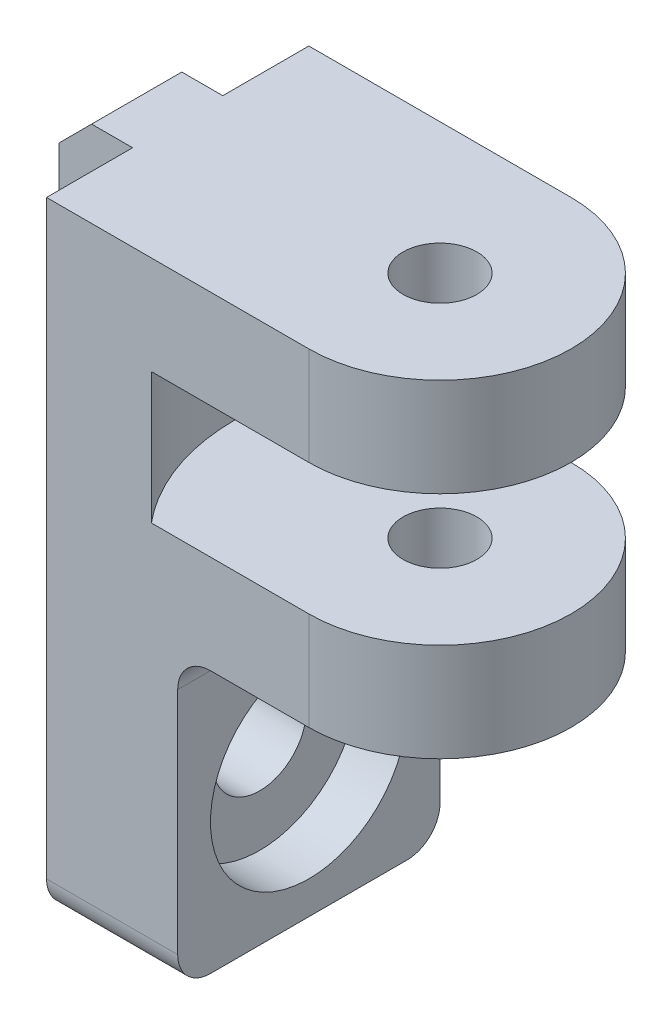
ISO-10303-21;
HEADER;
FILE_DESCRIPTION(('STEP AP214'),'2;1');
FILE_NAME('part.step','',(''),(''),'','','');
FILE_SCHEMA(('AUTOMOTIVE_DESIGN { 1 0 10303 214 1 1 1 1 }'));
ENDSEC;
DATA;
#1=APPLICATION_CONTEXT('core data for automotive mechanical design processes');
#2=APPLICATION_PROTOCOL_DEFINITION('international standard','automotive_design',2000,#1);
#3=PRODUCT_CONTEXT('',#1,'mechanical');
#4=PRODUCT('Part','Part','',(#3));
#5=PRODUCT_RELATED_PRODUCT_CATEGORY('part','',(#4));
#6=PRODUCT_DEFINITION_FORMATION('','',#4);
#7=PRODUCT_DEFINITION_CONTEXT('part definition',#1,'design');
#8=PRODUCT_DEFINITION('design','',#6,#7);
#9=PRODUCT_DEFINITION_SHAPE('','',#8);
#10=(LENGTH_UNIT() NAMED_UNIT(*) SI_UNIT(.MILLI.,.METRE.));
#11=(NAMED_UNIT(*) PLANE_ANGLE_UNIT() SI_UNIT($,.RADIAN.));
#12=(NAMED_UNIT(*) SI_UNIT($,.STERADIAN.) SOLID_ANGLE_UNIT());
#13=UNCERTAINTY_MEASURE_WITH_UNIT(LENGTH_MEASURE(1.E-05),#10,'distance_accuracy_value','');
#14=(GEOMETRIC_REPRESENTATION_CONTEXT(3) GLOBAL_UNCERTAINTY_ASSIGNED_CONTEXT((#13)) GLOBAL_UNIT_ASSIGNED_CONTEXT((#10,
#11,#12)) REPRESENTATION_CONTEXT('',''));
#15=CARTESIAN_POINT('',(0.,0.,0.));
#16=DIRECTION('',(0.,0.,1.));
#17=DIRECTION('',(1.,0.,0.));
#18=AXIS2_PLACEMENT_3D('',#15,#16,#17);
#19=CARTESIAN_POINT('',(8.,-2.08853598023942,48.8465560011747));
#20=DIRECTION('',(0.,0.,-1.));
#21=DIRECTION('',(-1.,0.,0.));
#22=AXIS2_PLACEMENT_3D('',#19,#20,#21);
#23=PLANE('',#22);
#24=DIRECTION('',(0.,-1.,0.));
#25=VECTOR('',#24,1.);
#26=CARTESIAN_POINT('',(0.,-2.08853598023942,48.8465560011747));
#27=LINE('',#26,#25);
#28=CARTESIAN_POINT('',(0.,35.9114640197606,48.8465560011747));
#29=VERTEX_POINT('',#28);
#30=CARTESIAN_POINT('',(0.,-0.0885359802394229,48.8465560011747));
#31=VERTEX_POINT('',#30);
#32=EDGE_CURVE('E302',#29,#31,#27,.T.);
#33=ORIENTED_EDGE('',*,*,#32,.T.);
#34=DIRECTION('',(-1.,0.,0.));
#35=VECTOR('',#34,1.);
#36=CARTESIAN_POINT('',(8.,-0.0885359802394229,48.8465560011747));
#37=LINE('',#36,#35);
#38=CARTESIAN_POINT('',(8.,-0.0885359802394229,48.8465560011747));
#39=VERTEX_POINT('',#38);
#40=EDGE_CURVE('E11',#31,#39,#37,.F.);
#41=ORIENTED_EDGE('',*,*,#40,.T.);
#42=DIRECTION('',(0.,-1.,0.));
#43=VECTOR('',#42,1.);
#44=CARTESIAN_POINT('',(8.,-2.08853598023942,48.8465560011747));
#45=LINE('',#44,#43);
#46=CARTESIAN_POINT('',(8.,13.9114640197606,48.8465560011747));
#47=VERTEX_POINT('',#46);
#48=EDGE_CURVE('E309',#47,#39,#45,.T.);
#49=ORIENTED_EDGE('',*,*,#48,.F.);
#50=CARTESIAN_POINT('',(10.,13.9114640197606,48.8465560011747));
#51=DIRECTION('',(0.,0.,-1.));
#52=DIRECTION('',(-1.,0.,0.));
#53=AXIS2_PLACEMENT_3D('',#50,#51,#52);
#54=CIRCLE('',#53,2.);
#55=CARTESIAN_POINT('',(10.,15.9114640197606,48.8465560011747));
#56=VERTEX_POINT('',#55);
#57=EDGE_CURVE('E265',#47,#56,#54,.T.);
#58=ORIENTED_EDGE('',*,*,#57,.T.);
#59=DIRECTION('',(-1.,0.,0.));
#60=VECTOR('',#59,1.);
#61=CARTESIAN_POINT('',(8.,15.9114640197606,48.8465560011747));
#62=LINE('',#61,#60);
#63=CARTESIAN_POINT('',(16.,15.9114640197606,48.8465560011747));
#64=VERTEX_POINT('',#63);
#65=EDGE_CURVE('E225',#64,#56,#62,.T.);
#66=ORIENTED_EDGE('',*,*,#65,.F.);
#67=DIRECTION('',(0.,1.,0.));
#68=VECTOR('',#67,1.);
#69=CARTESIAN_POINT('',(16.,15.9114640197606,48.8465560011747));
#70=LINE('',#69,#68);
#71=CARTESIAN_POINT('',(16.,21.9114640197606,48.8465560011747));
#72=VERTEX_POINT('',#71);
#73=EDGE_CURVE('E231',#64,#72,#70,.T.);
#74=ORIENTED_EDGE('',*,*,#73,.T.);
#75=DIRECTION('',(1.,0.,0.));
#76=VECTOR('',#75,1.);
#77=CARTESIAN_POINT('',(8.,21.9114640197606,48.8465560011747));
#78=LINE('',#77,#76);
#79=CARTESIAN_POINT('',(6.39531364385072,21.9114640197606,48.8465560011747));
#80=VERTEX_POINT('',#79);
#81=EDGE_CURVE('E202',#80,#72,#78,.T.);
#82=ORIENTED_EDGE('',*,*,#81,.F.);
#83=DIRECTION('',(0.,1.,0.));
#84=VECTOR('',#83,1.);
#85=CARTESIAN_POINT('',(6.39531364385072,21.9114640197606,48.8465560011747));
#86=LINE('',#85,#84);
#87=CARTESIAN_POINT('',(6.39531364385072,29.9114640197606,48.8465560011747));
#88=VERTEX_POINT('',#87);
#89=EDGE_CURVE('E204',#80,#88,#86,.T.);
#90=ORIENTED_EDGE('',*,*,#89,.T.);
#91=DIRECTION('',(1.,0.,0.));
#92=VECTOR('',#91,1.);
#93=CARTESIAN_POINT('',(8.,29.9114640197606,48.8465560011747));
#94=LINE('',#93,#92);
#95=CARTESIAN_POINT('',(16.,29.9114640197606,48.8465560011747));
#96=VERTEX_POINT('',#95);
#97=EDGE_CURVE('E184',#88,#96,#94,.T.);
#98=ORIENTED_EDGE('',*,*,#97,.T.);
#99=CARTESIAN_POINT('',(16.,35.9114640197606,48.8465560011747));
#100=VERTEX_POINT('',#99);
#101=EDGE_CURVE('E228',#96,#100,#70,.T.);
#102=ORIENTED_EDGE('',*,*,#101,.T.);
#103=DIRECTION('',(-1.,0.,0.));
#104=VECTOR('',#103,1.);
#105=CARTESIAN_POINT('',(8.,35.9114640197606,48.8465560011747));
#106=LINE('',#105,#104);
#107=EDGE_CURVE('E260',#100,#29,#106,.T.);
#108=ORIENTED_EDGE('',*,*,#107,.T.);
#109=EDGE_LOOP('',(#33,#41,#49,#58,#66,#74,#82,#90,#98,#102,#108));
#110=FACE_BOUND('',#109,.T.);
#111=ADVANCED_FACE('F32',(#110),#23,.F.);
#112=CARTESIAN_POINT('',(8.,35.9114640197606,32.8465560011747));
#113=DIRECTION('',(0.,0.,1.));
#114=DIRECTION('',(1.,0.,0.));
#115=AXIS2_PLACEMENT_3D('',#112,#113,#114);
#116=PLANE('',#115);
#117=DIRECTION('',(0.,1.,0.));
#118=VECTOR('',#117,1.);
#119=CARTESIAN_POINT('',(8.,35.9114640197606,32.8465560011747));
#120=LINE('',#119,#118);
#121=CARTESIAN_POINT('',(8.,-0.0885359802394181,32.8465560011747));
#122=VERTEX_POINT('',#121);
#123=CARTESIAN_POINT('',(8.,13.9114640197606,32.8465560011747));
#124=VERTEX_POINT('',#123);
#125=EDGE_CURVE('E300',#122,#124,#120,.T.);
#126=ORIENTED_EDGE('',*,*,#125,.F.);
#127=DIRECTION('',(-1.,0.,0.));
#128=VECTOR('',#127,1.);
#129=CARTESIAN_POINT('',(8.,-0.0885359802394181,32.8465560011747));
#130=LINE('',#129,#128);
#131=CARTESIAN_POINT('',(0.,-0.0885359802394181,32.8465560011747));
#132=VERTEX_POINT('',#131);
#133=EDGE_CURVE('E176',#122,#132,#130,.T.);
#134=ORIENTED_EDGE('',*,*,#133,.T.);
#135=DIRECTION('',(0.,1.,0.));
#136=VECTOR('',#135,1.);
#137=CARTESIAN_POINT('',(0.,35.9114640197606,32.8465560011747));
#138=LINE('',#137,#136);
#139=CARTESIAN_POINT('',(0.,35.9114640197606,32.8465560011747));
#140=VERTEX_POINT('',#139);
#141=EDGE_CURVE('E307',#132,#140,#138,.T.);
#142=ORIENTED_EDGE('',*,*,#141,.T.);
#143=DIRECTION('',(-1.,0.,0.));
#144=VECTOR('',#143,1.);
#145=CARTESIAN_POINT('',(8.,35.9114640197606,32.8465560011747));
#146=LINE('',#145,#144);
#147=CARTESIAN_POINT('',(16.,35.9114640197606,32.8465560011747));
#148=VERTEX_POINT('',#147);
#149=EDGE_CURVE('E310',#148,#140,#146,.T.);
#150=ORIENTED_EDGE('',*,*,#149,.F.);
#151=DIRECTION('',(0.,1.,0.));
#152=VECTOR('',#151,1.);
#153=CARTESIAN_POINT('',(16.,15.9114640197606,32.8465560011747));
#154=LINE('',#153,#152);
#155=CARTESIAN_POINT('',(16.,29.9114640197606,32.8465560011747));
#156=VERTEX_POINT('',#155);
#157=EDGE_CURVE('E190',#156,#148,#154,.T.);
#158=ORIENTED_EDGE('',*,*,#157,.F.);
#159=DIRECTION('',(-1.,0.,0.));
#160=VECTOR('',#159,1.);
#161=CARTESIAN_POINT('',(8.,29.9114640197606,32.8465560011747));
#162=LINE('',#161,#160);
#163=CARTESIAN_POINT('',(6.39531364385072,29.9114640197606,32.8465560011747));
#164=VERTEX_POINT('',#163);
#165=EDGE_CURVE('E181',#156,#164,#162,.T.);
#166=ORIENTED_EDGE('',*,*,#165,.T.);
#167=DIRECTION('',(0.,1.,0.));
#168=VECTOR('',#167,1.);
#169=CARTESIAN_POINT('',(6.39531364385072,21.9114640197606,32.8465560011747));
#170=LINE('',#169,#168);
#171=CARTESIAN_POINT('',(6.39531364385072,21.9114640197606,32.8465560011747));
#172=VERTEX_POINT('',#171);
#173=EDGE_CURVE('E166',#164,#172,#170,.F.);
#174=ORIENTED_EDGE('',*,*,#173,.T.);
#175=DIRECTION('',(-1.,0.,0.));
#176=VECTOR('',#175,1.);
#177=CARTESIAN_POINT('',(8.,21.9114640197606,32.8465560011747));
#178=LINE('',#177,#176);
#179=CARTESIAN_POINT('',(16.,21.9114640197606,32.8465560011747));
#180=VERTEX_POINT('',#179);
#181=EDGE_CURVE('E200',#180,#172,#178,.T.);
#182=ORIENTED_EDGE('',*,*,#181,.F.);
#183=CARTESIAN_POINT('',(16.,15.9114640197606,32.8465560011747));
#184=VERTEX_POINT('',#183);
#185=EDGE_CURVE('E234',#184,#180,#154,.T.);
#186=ORIENTED_EDGE('',*,*,#185,.F.);
#187=DIRECTION('',(1.,0.,0.));
#188=VECTOR('',#187,1.);
#189=CARTESIAN_POINT('',(16.,15.9114640197606,32.8465560011747));
#190=LINE('',#189,#188);
#191=CARTESIAN_POINT('',(10.,15.9114640197606,32.8465560011747));
#192=VERTEX_POINT('',#191);
#193=EDGE_CURVE('E221',#192,#184,#190,.T.);
#194=ORIENTED_EDGE('',*,*,#193,.F.);
#195=CARTESIAN_POINT('',(10.,13.9114640197606,32.8465560011747));
#196=DIRECTION('',(0.,0.,1.));
#197=DIRECTION('',(1.,0.,0.));
#198=AXIS2_PLACEMENT_3D('',#195,#196,#197);
#199=CIRCLE('',#198,2.);
#200=EDGE_CURVE('E262',#192,#124,#199,.T.);
#201=ORIENTED_EDGE('',*,*,#200,.T.);
#202=EDGE_LOOP('',(#126,#134,#142,#150,#158,#166,#174,#182,#186,#194,#201));
#203=FACE_BOUND('',#202,.T.);
#204=ADVANCED_FACE('F188',(#203),#116,.F.);
#205=CARTESIAN_POINT('',(16.,15.9114640197606,40.8465560011747));
#206=DIRECTION('',(0.,1.,0.));
#207=DIRECTION('',(0.,0.,1.));
#208=AXIS2_PLACEMENT_3D('',#205,#206,#207);
#209=CYLINDRICAL_SURFACE('',#208,8.);
#210=CARTESIAN_POINT('',(16.,21.9114640197606,40.8465560011747));
#211=DIRECTION('',(0.,1.,0.));
#212=DIRECTION('',(0.,0.,1.));
#213=AXIS2_PLACEMENT_3D('',#210,#211,#212);
#214=CIRCLE('',#213,8.);
#215=EDGE_CURVE('E198',#72,#180,#214,.T.);
#216=ORIENTED_EDGE('',*,*,#215,.F.);
#217=ORIENTED_EDGE('',*,*,#73,.F.);
#218=CARTESIAN_POINT('',(16.,15.9114640197606,40.8465560011747));
#219=DIRECTION('',(0.,-1.,0.));
#220=DIRECTION('',(0.,0.,-1.));
#221=AXIS2_PLACEMENT_3D('',#218,#219,#220);
#222=CIRCLE('',#221,8.);
#223=EDGE_CURVE('E223',#184,#64,#222,.T.);
#224=ORIENTED_EDGE('',*,*,#223,.F.);
#225=ORIENTED_EDGE('',*,*,#185,.T.);
#226=EDGE_LOOP('',(#216,#217,#224,#225));
#227=FACE_BOUND('',#226,.T.);
#228=ADVANCED_FACE('F401',(#227),#209,.T.);
#229=CARTESIAN_POINT('',(16.,15.9114640197606,40.8465560011747));
#230=DIRECTION('',(0.,1.,0.));
#231=DIRECTION('',(0.,0.,1.));
#232=AXIS2_PLACEMENT_3D('',#229,#230,#231);
#233=CYLINDRICAL_SURFACE('',#232,2.25);
#234=CARTESIAN_POINT('',(16.,15.9114640197606,40.8465560011747));
#235=DIRECTION('',(0.,-1.,0.));
#236=DIRECTION('',(0.,0.,-1.));
#237=AXIS2_PLACEMENT_3D('',#234,#235,#236);
#238=CIRCLE('',#237,2.25);
#239=CARTESIAN_POINT('',(16.,15.9114640197606,38.5965560011747));
#240=VERTEX_POINT('',#239);
#241=EDGE_CURVE('E213',#240,#240,#238,.T.);
#242=ORIENTED_EDGE('',*,*,#241,.T.);
#243=EDGE_LOOP('',(#242));
#244=FACE_BOUND('',#243,.T.);
#245=CARTESIAN_POINT('',(16.,21.9114640197606,40.8465560011747));
#246=DIRECTION('',(0.,1.,0.));
#247=DIRECTION('',(0.,0.,1.));
#248=AXIS2_PLACEMENT_3D('',#245,#246,#247);
#249=CIRCLE('',#248,2.25);
#250=CARTESIAN_POINT('',(16.,21.9114640197606,43.0965560011747));
#251=VERTEX_POINT('',#250);
#252=EDGE_CURVE('E193',#251,#251,#249,.T.);
#253=ORIENTED_EDGE('',*,*,#252,.T.);
#254=EDGE_LOOP('',(#253));
#255=FACE_BOUND('',#254,.T.);
#256=ADVANCED_FACE('F520',(#244,#255),#233,.F.);
#257=CARTESIAN_POINT('',(-2.,5.91146401976058,40.8465560011747));
#258=DIRECTION('',(1.,0.,0.));
#259=DIRECTION('',(0.,0.,-1.));
#260=AXIS2_PLACEMENT_3D('',#257,#258,#259);
#261=CYLINDRICAL_SURFACE('',#260,2.85);
#262=CARTESIAN_POINT('',(0.,5.91146401976058,40.8465560011747));
#263=DIRECTION('',(-1.,0.,0.));
#264=DIRECTION('',(0.,0.,1.));
#265=AXIS2_PLACEMENT_3D('',#262,#263,#264);
#266=CIRCLE('',#265,2.85);
#267=CARTESIAN_POINT('',(0.,5.91146401976058,43.6965560011747));
#268=VERTEX_POINT('',#267);
#269=EDGE_CURVE('E220',#268,#268,#266,.T.);
#270=ORIENTED_EDGE('',*,*,#269,.T.);
#271=EDGE_LOOP('',(#270));
#272=FACE_BOUND('',#271,.T.);
#273=CARTESIAN_POINT('',(5.,5.91146401976058,40.8465560011747));
#274=DIRECTION('',(1.,0.,0.));
#275=DIRECTION('',(0.,0.,-1.));
#276=AXIS2_PLACEMENT_3D('',#273,#274,#275);
#277=CIRCLE('',#276,2.85);
#278=CARTESIAN_POINT('',(5.,5.91146401976058,37.9965560011747));
#279=VERTEX_POINT('',#278);
#280=EDGE_CURVE('E210',#279,#279,#277,.F.);
#281=ORIENTED_EDGE('',*,*,#280,.F.);
#282=EDGE_LOOP('',(#281));
#283=FACE_BOUND('',#282,.T.);
#284=ADVANCED_FACE('F476',(#272,#283),#261,.F.);
#285=CARTESIAN_POINT('',(8.,0.,0.));
#286=DIRECTION('',(-1.,0.,0.));
#287=DIRECTION('',(0.,0.,1.));
#288=AXIS2_PLACEMENT_3D('',#285,#286,#287);
#289=PLANE('',#288);
#290=CARTESIAN_POINT('',(8.,5.91146401976058,40.8465560011747));
#291=DIRECTION('',(1.,0.,0.));
#292=DIRECTION('',(0.,0.,-1.));
#293=AXIS2_PLACEMENT_3D('',#290,#291,#292);
#294=CIRCLE('',#293,5.99999999999999);
#295=CARTESIAN_POINT('',(8.,5.91146401976058,34.8465560011747));
#296=VERTEX_POINT('',#295);
#297=EDGE_CURVE('E206',#296,#296,#294,.T.);
#298=ORIENTED_EDGE('',*,*,#297,.F.);
#299=EDGE_LOOP('',(#298));
#300=FACE_BOUND('',#299,.T.);
#301=DIRECTION('',(0.,0.,-1.));
#302=VECTOR('',#301,1.);
#303=CARTESIAN_POINT('',(8.,-2.08853598023942,32.8465560011747));
#304=LINE('',#303,#302);
#305=CARTESIAN_POINT('',(8.,-2.08853598023942,46.8465560011747));
#306=VERTEX_POINT('',#305);
#307=CARTESIAN_POINT('',(8.,-2.08853598023942,34.8465560011747));
#308=VERTEX_POINT('',#307);
#309=EDGE_CURVE('E369',#306,#308,#304,.T.);
#310=ORIENTED_EDGE('',*,*,#309,.T.);
#311=CARTESIAN_POINT('',(8.,-0.0885359802394181,34.8465560011747));
#312=DIRECTION('',(-1.,0.,0.));
#313=DIRECTION('',(0.,0.,1.));
#314=AXIS2_PLACEMENT_3D('',#311,#312,#313);
#315=CIRCLE('',#314,2.);
#316=EDGE_CURVE('E40',#308,#122,#315,.F.);
#317=ORIENTED_EDGE('',*,*,#316,.T.);
#318=ORIENTED_EDGE('',*,*,#125,.T.);
#319=DIRECTION('',(0.,0.,-1.));
#320=VECTOR('',#319,1.);
#321=CARTESIAN_POINT('',(8.,13.9114640197606,0.));
#322=LINE('',#321,#320);
#323=EDGE_CURVE('E259',#124,#47,#322,.F.);
#324=ORIENTED_EDGE('',*,*,#323,.T.);
#325=ORIENTED_EDGE('',*,*,#48,.T.);
#326=CARTESIAN_POINT('',(8.,-0.088535980239423,46.8465560011747));
#327=DIRECTION('',(-1.,0.,0.));
#328=DIRECTION('',(0.,0.,1.));
#329=AXIS2_PLACEMENT_3D('',#326,#327,#328);
#330=CIRCLE('',#329,2.);
#331=EDGE_CURVE('E365',#39,#306,#330,.F.);
#332=ORIENTED_EDGE('',*,*,#331,.T.);
#333=EDGE_LOOP('',(#310,#317,#318,#324,#325,#332));
#334=FACE_BOUND('',#333,.T.);
#335=ADVANCED_FACE('F368',(#300,#334),#289,.F.);
#336=CARTESIAN_POINT('',(8.,35.9114640197606,48.8465560011747));
#337=DIRECTION('',(0.,-1.,0.));
#338=DIRECTION('',(0.,0.,-1.));
#339=AXIS2_PLACEMENT_3D('',#336,#337,#338);
#340=PLANE('',#339);
#341=DIRECTION('',(1.,0.,0.));
#342=VECTOR('',#341,1.);
#343=CARTESIAN_POINT('',(-4.5,35.9114640197606,38.0965560011746));
#344=LINE('',#343,#342);
#345=CARTESIAN_POINT('',(-2.5,35.9114640197606,38.0965560011746));
#346=VERTEX_POINT('',#345);
#347=CARTESIAN_POINT('',(0.,35.9114640197606,38.0965560011746));
#348=VERTEX_POINT('',#347);
#349=EDGE_CURVE('E277',#346,#348,#344,.T.);
#350=ORIENTED_EDGE('',*,*,#349,.F.);
#351=DIRECTION('',(0.,0.,1.));
#352=VECTOR('',#351,1.);
#353=CARTESIAN_POINT('',(-2.5,35.9114640197606,43.5965560011746));
#354=LINE('',#353,#352);
#355=CARTESIAN_POINT('',(-2.5,35.9114640197606,43.5965560011746));
#356=VERTEX_POINT('',#355);
#357=EDGE_CURVE('E177',#346,#356,#354,.T.);
#358=ORIENTED_EDGE('',*,*,#357,.T.);
#359=DIRECTION('',(1.,0.,0.));
#360=VECTOR('',#359,1.);
#361=CARTESIAN_POINT('',(-4.5,35.9114640197606,43.5965560011746));
#362=LINE('',#361,#360);
#363=CARTESIAN_POINT('',(0.,35.9114640197606,43.5965560011747));
#364=VERTEX_POINT('',#363);
#365=EDGE_CURVE('E274',#356,#364,#362,.T.);
#366=ORIENTED_EDGE('',*,*,#365,.T.);
#367=DIRECTION('',(0.,0.,1.));
#368=VECTOR('',#367,1.);
#369=CARTESIAN_POINT('',(0.,35.9114640197606,48.8465560011747));
#370=LINE('',#369,#368);
#371=EDGE_CURVE('E276',#364,#29,#370,.T.);
#372=ORIENTED_EDGE('',*,*,#371,.T.);
#373=ORIENTED_EDGE('',*,*,#107,.F.);
#374=CARTESIAN_POINT('',(16.,35.9114640197606,40.8465560011747));
#375=DIRECTION('',(0.,-1.,0.));
#376=DIRECTION('',(0.,0.,-1.));
#377=AXIS2_PLACEMENT_3D('',#374,#375,#376);
#378=CIRCLE('',#377,8.);
#379=EDGE_CURVE('E216',#148,#100,#378,.T.);
#380=ORIENTED_EDGE('',*,*,#379,.F.);
#381=ORIENTED_EDGE('',*,*,#149,.T.);
#382=EDGE_CURVE('E295',#140,#348,#370,.T.);
#383=ORIENTED_EDGE('',*,*,#382,.T.);
#384=EDGE_LOOP('',(#350,#358,#366,#372,#373,#380,#381,#383));
#385=FACE_BOUND('',#384,.T.);
#386=CARTESIAN_POINT('',(16.,35.9114640197606,40.8465560011747));
#387=DIRECTION('',(0.,-1.,0.));
#388=DIRECTION('',(0.,0.,-1.));
#389=AXIS2_PLACEMENT_3D('',#386,#387,#388);
#390=CIRCLE('',#389,2.25);
#391=CARTESIAN_POINT('',(16.,35.9114640197606,38.5965560011747));
#392=VERTEX_POINT('',#391);
#393=EDGE_CURVE('E217',#392,#392,#390,.T.);
#394=ORIENTED_EDGE('',*,*,#393,.T.);
#395=EDGE_LOOP('',(#394));
#396=FACE_BOUND('',#395,.T.);
#397=ADVANCED_FACE('F319',(#385,#396),#340,.F.);
#398=CARTESIAN_POINT('',(8.,-2.08853598023942,32.8465560011747));
#399=DIRECTION('',(0.,1.,0.));
#400=DIRECTION('',(0.,0.,1.));
#401=AXIS2_PLACEMENT_3D('',#398,#399,#400);
#402=PLANE('',#401);
#403=DIRECTION('',(0.,0.,-1.));
#404=VECTOR('',#403,1.);
#405=CARTESIAN_POINT('',(0.,-2.08853598023942,32.8465560011747));
#406=LINE('',#405,#404);
#407=CARTESIAN_POINT('',(0.,-2.08853598023942,46.8465560011747));
#408=VERTEX_POINT('',#407);
#409=CARTESIAN_POINT('',(0.,-2.08853598023942,34.8465560011747));
#410=VERTEX_POINT('',#409);
#411=EDGE_CURVE('E305',#408,#410,#406,.T.);
#412=ORIENTED_EDGE('',*,*,#411,.T.);
#413=DIRECTION('',(-1.,0.,0.));
#414=VECTOR('',#413,1.);
#415=CARTESIAN_POINT('',(8.,-2.08853598023942,34.8465560011747));
#416=LINE('',#415,#414);
#417=EDGE_CURVE('E53',#410,#308,#416,.F.);
#418=ORIENTED_EDGE('',*,*,#417,.T.);
#419=ORIENTED_EDGE('',*,*,#309,.F.);
#420=DIRECTION('',(-1.,0.,0.));
#421=VECTOR('',#420,1.);
#422=CARTESIAN_POINT('',(8.,-2.08853598023942,46.8465560011747));
#423=LINE('',#422,#421);
#424=EDGE_CURVE('E361',#306,#408,#423,.T.);
#425=ORIENTED_EDGE('',*,*,#424,.T.);
#426=EDGE_LOOP('',(#412,#418,#419,#425));
#427=FACE_BOUND('',#426,.T.);
#428=ADVANCED_FACE('F376',(#427),#402,.F.);
#429=CARTESIAN_POINT('',(0.,0.,0.));
#430=DIRECTION('',(-1.,0.,0.));
#431=DIRECTION('',(0.,0.,1.));
#432=AXIS2_PLACEMENT_3D('',#429,#430,#431);
#433=PLANE('',#432);
#434=ORIENTED_EDGE('',*,*,#269,.F.);
#435=EDGE_LOOP('',(#434));
#436=FACE_BOUND('',#435,.T.);
#437=ORIENTED_EDGE('',*,*,#141,.F.);
#438=CARTESIAN_POINT('',(0.,-0.0885359802394181,34.8465560011747));
#439=DIRECTION('',(-1.,0.,0.));
#440=DIRECTION('',(0.,0.,1.));
#441=AXIS2_PLACEMENT_3D('',#438,#439,#440);
#442=CIRCLE('',#441,2.);
#443=EDGE_CURVE('E359',#132,#410,#442,.T.);
#444=ORIENTED_EDGE('',*,*,#443,.T.);
#445=ORIENTED_EDGE('',*,*,#411,.F.);
#446=CARTESIAN_POINT('',(0.,-0.088535980239423,46.8465560011747));
#447=DIRECTION('',(-1.,0.,0.));
#448=DIRECTION('',(0.,0.,1.));
#449=AXIS2_PLACEMENT_3D('',#446,#447,#448);
#450=CIRCLE('',#449,2.);
#451=EDGE_CURVE('E357',#408,#31,#450,.T.);
#452=ORIENTED_EDGE('',*,*,#451,.T.);
#453=ORIENTED_EDGE('',*,*,#32,.F.);
#454=ORIENTED_EDGE('',*,*,#371,.F.);
#455=DIRECTION('',(0.,1.,0.));
#456=VECTOR('',#455,1.);
#457=CARTESIAN_POINT('',(0.,35.9114640197606,43.5965560011746));
#458=LINE('',#457,#456);
#459=CARTESIAN_POINT('',(0.,13.9114640197606,43.5965560011747));
#460=VERTEX_POINT('',#459);
#461=EDGE_CURVE('E237',#460,#364,#458,.T.);
#462=ORIENTED_EDGE('',*,*,#461,.F.);
#463=DIRECTION('',(0.,0.,1.));
#464=VECTOR('',#463,1.);
#465=CARTESIAN_POINT('',(0.,13.9114640197606,38.0965560011747));
#466=LINE('',#465,#464);
#467=CARTESIAN_POINT('',(0.,13.9114640197606,38.0965560011747));
#468=VERTEX_POINT('',#467);
#469=EDGE_CURVE('E242',#468,#460,#466,.T.);
#470=ORIENTED_EDGE('',*,*,#469,.F.);
#471=DIRECTION('',(0.,-1.,0.));
#472=VECTOR('',#471,1.);
#473=CARTESIAN_POINT('',(0.,35.9114640197606,38.0965560011746));
#474=LINE('',#473,#472);
#475=EDGE_CURVE('E253',#348,#468,#474,.T.);
#476=ORIENTED_EDGE('',*,*,#475,.F.);
#477=ORIENTED_EDGE('',*,*,#382,.F.);
#478=EDGE_LOOP('',(#437,#444,#445,#452,#453,#454,#462,#470,#476,#477));
#479=FACE_BOUND('',#478,.T.);
#480=ADVANCED_FACE('F330',(#436,#479),#433,.T.);
#481=CARTESIAN_POINT('',(-4.5,35.9114640197606,43.5965560011746));
#482=DIRECTION('',(0.,0.,-1.));
#483=DIRECTION('',(0.,1.,0.));
#484=AXIS2_PLACEMENT_3D('',#481,#482,#483);
#485=PLANE('',#484);
#486=DIRECTION('',(0.,1.,0.));
#487=VECTOR('',#486,1.);
#488=CARTESIAN_POINT('',(-4.5,35.9114640197606,43.5965560011746));
#489=LINE('',#488,#487);
#490=CARTESIAN_POINT('',(-4.5,15.9114640197606,43.5965560011747));
#491=VERTEX_POINT('',#490);
#492=CARTESIAN_POINT('',(-4.5,33.9114640197606,43.5965560011746));
#493=VERTEX_POINT('',#492);
#494=EDGE_CURVE('E238',#491,#493,#489,.T.);
#495=ORIENTED_EDGE('',*,*,#494,.F.);
#496=DIRECTION('',(0.707106781186548,-0.707106781186548,0.));
#497=VECTOR('',#496,1.);
#498=CARTESIAN_POINT('',(-4.50000000000001,15.9114640197606,43.5965560011747));
#499=LINE('',#498,#497);
#500=CARTESIAN_POINT('',(-2.5,13.9114640197606,43.5965560011747));
#501=VERTEX_POINT('',#500);
#502=EDGE_CURVE('E279',#491,#501,#499,.T.);
#503=ORIENTED_EDGE('',*,*,#502,.T.);
#504=DIRECTION('',(1.,0.,0.));
#505=VECTOR('',#504,1.);
#506=CARTESIAN_POINT('',(-4.5,13.9114640197606,43.5965560011747));
#507=LINE('',#506,#505);
#508=EDGE_CURVE('E245',#501,#460,#507,.T.);
#509=ORIENTED_EDGE('',*,*,#508,.T.);
#510=ORIENTED_EDGE('',*,*,#461,.T.);
#511=ORIENTED_EDGE('',*,*,#365,.F.);
#512=DIRECTION('',(-0.707106781186547,-0.707106781186548,0.));
#513=VECTOR('',#512,1.);
#514=CARTESIAN_POINT('',(-4.49999999999999,33.9114640197606,43.5965560011746));
#515=LINE('',#514,#513);
#516=EDGE_CURVE('E273',#356,#493,#515,.T.);
#517=ORIENTED_EDGE('',*,*,#516,.T.);
#518=EDGE_LOOP('',(#495,#503,#509,#510,#511,#517));
#519=FACE_BOUND('',#518,.T.);
#520=ADVANCED_FACE('F382',(#519),#485,.F.);
#521=CARTESIAN_POINT('',(-4.5,35.9114640197606,38.0965560011746));
#522=DIRECTION('',(0.,0.,1.));
#523=DIRECTION('',(0.,-1.,0.));
#524=AXIS2_PLACEMENT_3D('',#521,#522,#523);
#525=PLANE('',#524);
#526=DIRECTION('',(1.,0.,0.));
#527=VECTOR('',#526,1.);
#528=CARTESIAN_POINT('',(-4.5,13.9114640197606,38.0965560011747));
#529=LINE('',#528,#527);
#530=CARTESIAN_POINT('',(-2.5,13.9114640197606,38.0965560011747));
#531=VERTEX_POINT('',#530);
#532=EDGE_CURVE('E285',#531,#468,#529,.T.);
#533=ORIENTED_EDGE('',*,*,#532,.F.);
#534=DIRECTION('',(-0.707106781186548,0.707106781186548,0.));
#535=VECTOR('',#534,1.);
#536=CARTESIAN_POINT('',(-4.50000000000001,15.9114640197606,38.0965560011747));
#537=LINE('',#536,#535);
#538=CARTESIAN_POINT('',(-4.5,15.9114640197606,38.0965560011747));
#539=VERTEX_POINT('',#538);
#540=EDGE_CURVE('E345',#531,#539,#537,.T.);
#541=ORIENTED_EDGE('',*,*,#540,.T.);
#542=DIRECTION('',(0.,-1.,0.));
#543=VECTOR('',#542,1.);
#544=CARTESIAN_POINT('',(-4.5,35.9114640197606,38.0965560011746));
#545=LINE('',#544,#543);
#546=CARTESIAN_POINT('',(-4.5,33.9114640197606,38.0965560011746));
#547=VERTEX_POINT('',#546);
#548=EDGE_CURVE('E241',#547,#539,#545,.T.);
#549=ORIENTED_EDGE('',*,*,#548,.F.);
#550=DIRECTION('',(0.707106781186547,0.707106781186548,0.));
#551=VECTOR('',#550,1.);
#552=CARTESIAN_POINT('',(-4.49999999999999,33.9114640197606,38.0965560011746));
#553=LINE('',#552,#551);
#554=EDGE_CURVE('E283',#547,#346,#553,.T.);
#555=ORIENTED_EDGE('',*,*,#554,.T.);
#556=ORIENTED_EDGE('',*,*,#349,.T.);
#557=ORIENTED_EDGE('',*,*,#475,.T.);
#558=EDGE_LOOP('',(#533,#541,#549,#555,#556,#557));
#559=FACE_BOUND('',#558,.T.);
#560=ADVANCED_FACE('F336',(#559),#525,.F.);
#561=CARTESIAN_POINT('',(-4.5,13.9114640197606,38.0965560011747));
#562=DIRECTION('',(0.,1.,0.));
#563=DIRECTION('',(0.,0.,1.));
#564=AXIS2_PLACEMENT_3D('',#561,#562,#563);
#565=PLANE('',#564);
#566=ORIENTED_EDGE('',*,*,#508,.F.);
#567=DIRECTION('',(0.,0.,-1.));
#568=VECTOR('',#567,1.);
#569=CARTESIAN_POINT('',(-2.5,13.9114640197606,38.0965560011747));
#570=LINE('',#569,#568);
#571=EDGE_CURVE('E281',#501,#531,#570,.T.);
#572=ORIENTED_EDGE('',*,*,#571,.T.);
#573=ORIENTED_EDGE('',*,*,#532,.T.);
#574=ORIENTED_EDGE('',*,*,#469,.T.);
#575=EDGE_LOOP('',(#566,#572,#573,#574));
#576=FACE_BOUND('',#575,.T.);
#577=ADVANCED_FACE('F590',(#576),#565,.F.);
#578=CARTESIAN_POINT('',(-4.5,0.,0.));
#579=DIRECTION('',(-1.,0.,0.));
#580=DIRECTION('',(0.,0.,1.));
#581=AXIS2_PLACEMENT_3D('',#578,#579,#580);
#582=PLANE('',#581);
#583=ORIENTED_EDGE('',*,*,#548,.T.);
#584=DIRECTION('',(0.,0.,1.));
#585=VECTOR('',#584,1.);
#586=CARTESIAN_POINT('',(-4.5,15.9114640197606,43.5965560011747));
#587=LINE('',#586,#585);
#588=EDGE_CURVE('E270',#539,#491,#587,.T.);
#589=ORIENTED_EDGE('',*,*,#588,.T.);
#590=ORIENTED_EDGE('',*,*,#494,.T.);
#591=DIRECTION('',(0.,0.,-1.));
#592=VECTOR('',#591,1.);
#593=CARTESIAN_POINT('',(-4.5,33.9114640197606,38.0965560011746));
#594=LINE('',#593,#592);
#595=EDGE_CURVE('E267',#493,#547,#594,.T.);
#596=ORIENTED_EDGE('',*,*,#595,.T.);
#597=EDGE_LOOP('',(#583,#589,#590,#596));
#598=FACE_BOUND('',#597,.T.);
#599=ADVANCED_FACE('F586',(#598),#582,.T.);
#600=CARTESIAN_POINT('',(16.,15.9114640197606,40.8465560011747));
#601=DIRECTION('',(0.,-1.,0.));
#602=DIRECTION('',(0.,0.,-1.));
#603=AXIS2_PLACEMENT_3D('',#600,#601,#602);
#604=PLANE('',#603);
#605=ORIENTED_EDGE('',*,*,#65,.T.);
#606=DIRECTION('',(0.,0.,-1.));
#607=VECTOR('',#606,1.);
#608=CARTESIAN_POINT('',(10.,15.9114640197606,40.8465560011747));
#609=LINE('',#608,#607);
#610=EDGE_CURVE('E256',#56,#192,#609,.T.);
#611=ORIENTED_EDGE('',*,*,#610,.T.);
#612=ORIENTED_EDGE('',*,*,#193,.T.);
#613=ORIENTED_EDGE('',*,*,#223,.T.);
#614=EDGE_LOOP('',(#605,#611,#612,#613));
#615=FACE_BOUND('',#614,.T.);
#616=ORIENTED_EDGE('',*,*,#241,.F.);
#617=EDGE_LOOP('',(#616));
#618=FACE_BOUND('',#617,.T.);
#619=ADVANCED_FACE('F394',(#615,#618),#604,.T.);
#620=ORIENTED_EDGE('',*,*,#101,.F.);
#621=CARTESIAN_POINT('',(16.,29.9114640197606,40.8465560011747));
#622=DIRECTION('',(0.,1.,0.));
#623=DIRECTION('',(0.,0.,1.));
#624=AXIS2_PLACEMENT_3D('',#621,#622,#623);
#625=CIRCLE('',#624,8.);
#626=EDGE_CURVE('E191',#96,#156,#625,.T.);
#627=ORIENTED_EDGE('',*,*,#626,.T.);
#628=ORIENTED_EDGE('',*,*,#157,.T.);
#629=ORIENTED_EDGE('',*,*,#379,.T.);
#630=EDGE_LOOP('',(#620,#627,#628,#629));
#631=FACE_BOUND('',#630,.T.);
#632=ADVANCED_FACE('F323',(#631),#209,.T.);
#633=CARTESIAN_POINT('',(16.,29.9114640197606,40.8465560011747));
#634=DIRECTION('',(0.,1.,0.));
#635=DIRECTION('',(0.,0.,1.));
#636=AXIS2_PLACEMENT_3D('',#633,#634,#635);
#637=CIRCLE('',#636,2.25);
#638=CARTESIAN_POINT('',(16.,29.9114640197606,43.0965560011747));
#639=VERTEX_POINT('',#638);
#640=EDGE_CURVE('E195',#639,#639,#637,.T.);
#641=ORIENTED_EDGE('',*,*,#640,.F.);
#642=EDGE_LOOP('',(#641));
#643=FACE_BOUND('',#642,.T.);
#644=ORIENTED_EDGE('',*,*,#393,.F.);
#645=EDGE_LOOP('',(#644));
#646=FACE_BOUND('',#645,.T.);
#647=ADVANCED_FACE('F431',(#643,#646),#233,.F.);
#648=CARTESIAN_POINT('',(10.,13.9114640197606,40.8465560011747));
#649=DIRECTION('',(0.,0.,-1.));
#650=DIRECTION('',(0.,1.,0.));
#651=AXIS2_PLACEMENT_3D('',#648,#649,#650);
#652=CYLINDRICAL_SURFACE('',#651,2.);
#653=ORIENTED_EDGE('',*,*,#57,.F.);
#654=ORIENTED_EDGE('',*,*,#323,.F.);
#655=ORIENTED_EDGE('',*,*,#200,.F.);
#656=ORIENTED_EDGE('',*,*,#610,.F.);
#657=EDGE_LOOP('',(#653,#654,#655,#656));
#658=FACE_BOUND('',#657,.T.);
#659=ADVANCED_FACE('F392',(#658),#652,.F.);
#660=CARTESIAN_POINT('',(-4.5,15.9114640197606,0.));
#661=DIRECTION('',(-0.707106781186547,-0.707106781186547,0.));
#662=DIRECTION('',(0.,0.,-1.));
#663=AXIS2_PLACEMENT_3D('',#660,#661,#662);
#664=PLANE('',#663);
#665=ORIENTED_EDGE('',*,*,#540,.F.);
#666=ORIENTED_EDGE('',*,*,#571,.F.);
#667=ORIENTED_EDGE('',*,*,#502,.F.);
#668=ORIENTED_EDGE('',*,*,#588,.F.);
#669=EDGE_LOOP('',(#665,#666,#667,#668));
#670=FACE_BOUND('',#669,.T.);
#671=ADVANCED_FACE('F430',(#670),#664,.T.);
#672=CARTESIAN_POINT('',(-4.5,33.9114640197606,0.));
#673=DIRECTION('',(-0.707106781186548,0.707106781186547,0.));
#674=DIRECTION('',(0.,0.,1.));
#675=AXIS2_PLACEMENT_3D('',#672,#673,#674);
#676=PLANE('',#675);
#677=ORIENTED_EDGE('',*,*,#516,.F.);
#678=ORIENTED_EDGE('',*,*,#357,.F.);
#679=ORIENTED_EDGE('',*,*,#554,.F.);
#680=ORIENTED_EDGE('',*,*,#595,.F.);
#681=EDGE_LOOP('',(#677,#678,#679,#680));
#682=FACE_BOUND('',#681,.T.);
#683=ADVANCED_FACE('F343',(#682),#676,.T.);
#684=CARTESIAN_POINT('',(5.,5.91146401976058,40.8465560011747));
#685=DIRECTION('',(1.,0.,0.));
#686=DIRECTION('',(0.,0.,-1.));
#687=AXIS2_PLACEMENT_3D('',#684,#685,#686);
#688=PLANE('',#687);
#689=CARTESIAN_POINT('',(5.,5.91146401976058,40.8465560011747));
#690=DIRECTION('',(1.,0.,0.));
#691=DIRECTION('',(0.,0.,-1.));
#692=AXIS2_PLACEMENT_3D('',#689,#690,#691);
#693=CIRCLE('',#692,5.99999999999999);
#694=CARTESIAN_POINT('',(5.,5.91146401976058,34.8465560011747));
#695=VERTEX_POINT('',#694);
#696=EDGE_CURVE('E207',#695,#695,#693,.T.);
#697=ORIENTED_EDGE('',*,*,#696,.T.);
#698=EDGE_LOOP('',(#697));
#699=FACE_BOUND('',#698,.T.);
#700=ORIENTED_EDGE('',*,*,#280,.T.);
#701=EDGE_LOOP('',(#700));
#702=FACE_BOUND('',#701,.T.);
#703=ADVANCED_FACE('F436',(#699,#702),#688,.T.);
#704=CARTESIAN_POINT('',(5.,5.91146401976058,40.8465560011747));
#705=DIRECTION('',(1.,0.,0.));
#706=DIRECTION('',(0.,0.,-1.));
#707=AXIS2_PLACEMENT_3D('',#704,#705,#706);
#708=CYLINDRICAL_SURFACE('',#707,5.99999999999999);
#709=ORIENTED_EDGE('',*,*,#696,.F.);
#710=EDGE_LOOP('',(#709));
#711=FACE_BOUND('',#710,.T.);
#712=ORIENTED_EDGE('',*,*,#297,.T.);
#713=EDGE_LOOP('',(#712));
#714=FACE_BOUND('',#713,.T.);
#715=ADVANCED_FACE('F415',(#711,#714),#708,.F.);
#716=CARTESIAN_POINT('',(16.,21.9114640197606,40.8465560011747));
#717=DIRECTION('',(0.,1.,0.));
#718=DIRECTION('',(0.,0.,1.));
#719=AXIS2_PLACEMENT_3D('',#716,#717,#718);
#720=CYLINDRICAL_SURFACE('',#719,12.5);
#721=CARTESIAN_POINT('',(16.,21.9114640197606,40.8465560011747));
#722=DIRECTION('',(0.,1.,0.));
#723=DIRECTION('',(0.,0.,1.));
#724=AXIS2_PLACEMENT_3D('',#721,#722,#723);
#725=CIRCLE('',#724,12.5);
#726=EDGE_CURVE('E172',#172,#80,#725,.T.);
#727=ORIENTED_EDGE('',*,*,#726,.F.);
#728=ORIENTED_EDGE('',*,*,#173,.F.);
#729=CARTESIAN_POINT('',(16.,29.9114640197606,40.8465560011747));
#730=DIRECTION('',(0.,1.,0.));
#731=DIRECTION('',(0.,0.,1.));
#732=AXIS2_PLACEMENT_3D('',#729,#730,#731);
#733=CIRCLE('',#732,12.5);
#734=EDGE_CURVE('E169',#164,#88,#733,.T.);
#735=ORIENTED_EDGE('',*,*,#734,.T.);
#736=ORIENTED_EDGE('',*,*,#89,.F.);
#737=EDGE_LOOP('',(#727,#728,#735,#736));
#738=FACE_BOUND('',#737,.T.);
#739=ADVANCED_FACE('F168',(#738),#720,.F.);
#740=CARTESIAN_POINT('',(16.,21.9114640197606,40.8465560011747));
#741=DIRECTION('',(0.,1.,0.));
#742=DIRECTION('',(0.,0.,1.));
#743=AXIS2_PLACEMENT_3D('',#740,#741,#742);
#744=PLANE('',#743);
#745=ORIENTED_EDGE('',*,*,#252,.F.);
#746=EDGE_LOOP('',(#745));
#747=FACE_BOUND('',#746,.T.);
#748=ORIENTED_EDGE('',*,*,#81,.T.);
#749=ORIENTED_EDGE('',*,*,#215,.T.);
#750=ORIENTED_EDGE('',*,*,#181,.T.);
#751=ORIENTED_EDGE('',*,*,#726,.T.);
#752=EDGE_LOOP('',(#748,#749,#750,#751));
#753=FACE_BOUND('',#752,.T.);
#754=ADVANCED_FACE('F404',(#747,#753),#744,.T.);
#755=CARTESIAN_POINT('',(16.,29.9114640197606,40.8465560011747));
#756=DIRECTION('',(0.,1.,0.));
#757=DIRECTION('',(0.,0.,1.));
#758=AXIS2_PLACEMENT_3D('',#755,#756,#757);
#759=PLANE('',#758);
#760=ORIENTED_EDGE('',*,*,#640,.T.);
#761=EDGE_LOOP('',(#760));
#762=FACE_BOUND('',#761,.T.);
#763=ORIENTED_EDGE('',*,*,#734,.F.);
#764=ORIENTED_EDGE('',*,*,#165,.F.);
#765=ORIENTED_EDGE('',*,*,#626,.F.);
#766=ORIENTED_EDGE('',*,*,#97,.F.);
#767=EDGE_LOOP('',(#763,#764,#765,#766));
#768=FACE_BOUND('',#767,.T.);
#769=ADVANCED_FACE('F180',(#762,#768),#759,.F.);
#770=CARTESIAN_POINT('',(8.,-0.0885359802394181,34.8465560011747));
#771=DIRECTION('',(-1.,0.,0.));
#772=DIRECTION('',(0.,0.,1.));
#773=AXIS2_PLACEMENT_3D('',#770,#771,#772);
#774=CYLINDRICAL_SURFACE('',#773,2.);
#775=ORIENTED_EDGE('',*,*,#316,.F.);
#776=ORIENTED_EDGE('',*,*,#417,.F.);
#777=ORIENTED_EDGE('',*,*,#443,.F.);
#778=ORIENTED_EDGE('',*,*,#133,.F.);
#779=EDGE_LOOP('',(#775,#776,#777,#778));
#780=FACE_BOUND('',#779,.T.);
#781=ADVANCED_FACE('F374',(#780),#774,.T.);
#782=CARTESIAN_POINT('',(8.,-0.088535980239423,46.8465560011747));
#783=DIRECTION('',(-1.,0.,0.));
#784=DIRECTION('',(0.,0.,1.));
#785=AXIS2_PLACEMENT_3D('',#782,#783,#784);
#786=CYLINDRICAL_SURFACE('',#785,2.);
#787=ORIENTED_EDGE('',*,*,#331,.F.);
#788=ORIENTED_EDGE('',*,*,#40,.F.);
#789=ORIENTED_EDGE('',*,*,#451,.F.);
#790=ORIENTED_EDGE('',*,*,#424,.F.);
#791=EDGE_LOOP('',(#787,#788,#789,#790));
#792=FACE_BOUND('',#791,.T.);
#793=ADVANCED_FACE('F34',(#792),#786,.T.);
#794=CLOSED_SHELL('',(#111,#204,#228,#256,#284,#335,#397,#428,#480,#520,#560,#577,#599,#619,
#632,#647,#659,#671,#683,#703,#715,#739,#754,#769,#781,#793));
#795=MANIFOLD_SOLID_BREP('B2',#794);
#796=ADVANCED_BREP_SHAPE_REPRESENTATION('',(#18,#795),#14);
#797=SHAPE_DEFINITION_REPRESENTATION(#9,#796);
ENDSEC;
END-ISO-10303-21;
